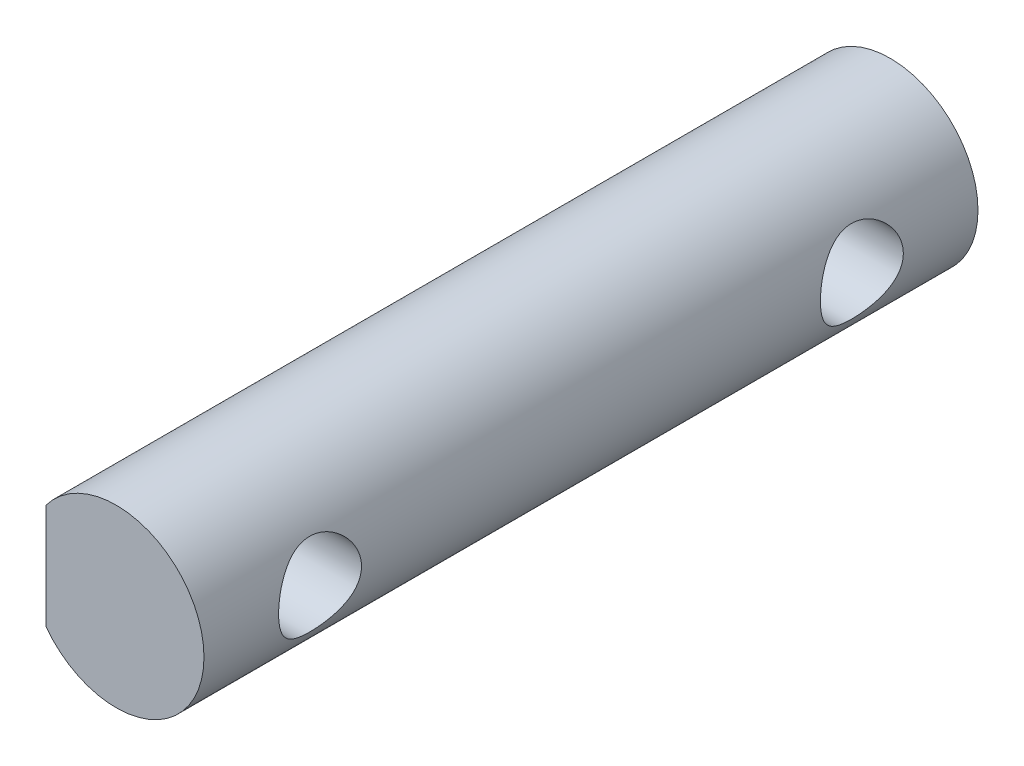
ISO-10303-21;
HEADER;
FILE_DESCRIPTION(('STEP AP214'),'2;1');
FILE_NAME('part.step','',(''),(''),'','','');
FILE_SCHEMA(('AUTOMOTIVE_DESIGN { 1 0 10303 214 1 1 1 1 }'));
ENDSEC;
DATA;
#1=APPLICATION_CONTEXT('core data for automotive mechanical design processes');
#2=APPLICATION_PROTOCOL_DEFINITION('international standard','automotive_design',2000,#1);
#3=PRODUCT_CONTEXT('',#1,'mechanical');
#4=PRODUCT('Part','Part','',(#3));
#5=PRODUCT_RELATED_PRODUCT_CATEGORY('part','',(#4));
#6=PRODUCT_DEFINITION_FORMATION('','',#4);
#7=PRODUCT_DEFINITION_CONTEXT('part definition',#1,'design');
#8=PRODUCT_DEFINITION('design','',#6,#7);
#9=PRODUCT_DEFINITION_SHAPE('','',#8);
#10=(LENGTH_UNIT() NAMED_UNIT(*) SI_UNIT(.MILLI.,.METRE.));
#11=(NAMED_UNIT(*) PLANE_ANGLE_UNIT() SI_UNIT($,.RADIAN.));
#12=(NAMED_UNIT(*) SI_UNIT($,.STERADIAN.) SOLID_ANGLE_UNIT());
#13=UNCERTAINTY_MEASURE_WITH_UNIT(LENGTH_MEASURE(1.E-05),#10,'distance_accuracy_value','');
#14=(GEOMETRIC_REPRESENTATION_CONTEXT(3) GLOBAL_UNCERTAINTY_ASSIGNED_CONTEXT((#13)) GLOBAL_UNIT_ASSIGNED_CONTEXT((#10,
#11,#12)) REPRESENTATION_CONTEXT('',''));
#15=CARTESIAN_POINT('',(0.,0.,0.));
#16=DIRECTION('',(0.,0.,1.));
#17=DIRECTION('',(1.,0.,0.));
#18=AXIS2_PLACEMENT_3D('',#15,#16,#17);
#19=CARTESIAN_POINT('',(0.,0.,28.));
#20=DIRECTION('',(0.,0.,-1.));
#21=DIRECTION('',(-1.,0.,0.));
#22=AXIS2_PLACEMENT_3D('',#19,#20,#21);
#23=CYLINDRICAL_SURFACE('',#22,3.175);
#24=CARTESIAN_POINT('',(3.175,0.,5.7));
#25=CARTESIAN_POINT('',(3.17499621985294,-0.0793696056331877,5.69999552610351));
#26=CARTESIAN_POINT('',(3.17199120370814,-0.158848966213319,5.69366335348418));
#27=CARTESIAN_POINT('',(3.16026762742416,-0.3154907966577,5.6685996128575));
#28=CARTESIAN_POINT('',(3.15153670753249,-0.392647876041672,5.64984122112576));
#29=CARTESIAN_POINT('',(3.1292818514019,-0.54213461401645,5.60080463386028));
#30=CARTESIAN_POINT('',(3.11577583396693,-0.614481134826974,5.57056947468804));
#31=CARTESIAN_POINT('',(3.08523557557938,-0.75298275747988,5.49964446831745));
#32=CARTESIAN_POINT('',(3.06820187122341,-0.819138798737005,5.45895621091421));
#33=CARTESIAN_POINT('',(3.03109215002452,-0.947531977551392,5.36568662754687));
#34=CARTESIAN_POINT('',(3.01089949607389,-1.00934531536298,5.31256891765261));
#35=CARTESIAN_POINT('',(2.97016877751052,-1.12356872804671,5.19709401541805));
#36=CARTESIAN_POINT('',(2.94963048974006,-1.17597245123061,5.13473063351146));
#37=CARTESIAN_POINT('',(2.90895734211161,-1.27340721108708,4.9974843645497));
#38=CARTESIAN_POINT('',(2.88894252906622,-1.31770529611402,4.92204154314482));
#39=CARTESIAN_POINT('',(2.85350194913633,-1.39279860497067,4.76371450605077));
#40=CARTESIAN_POINT('',(2.83807319122874,-1.4236026358555,4.68083518657092));
#41=CARTESIAN_POINT('',(2.81484981523147,-1.46896762087975,4.51481732997647));
#42=CARTESIAN_POINT('',(2.80667245171199,-1.48434942407678,4.43195910458647));
#43=CARTESIAN_POINT('',(2.79782290647243,-1.50096994970779,4.26446669966953));
#44=CARTESIAN_POINT('',(2.79714463118969,-1.5022201551264,4.17983401805993));
#45=CARTESIAN_POINT('',(2.80305593263808,-1.49114871052963,4.02062469140227));
#46=CARTESIAN_POINT('',(2.80889771224103,-1.48022366031689,3.94591684055565));
#47=CARTESIAN_POINT('',(2.82589657910714,-1.44750469243097,3.79955531913525));
#48=CARTESIAN_POINT('',(2.83705508237193,-1.42570787921159,3.72790246774061));
#49=CARTESIAN_POINT('',(2.86368711079333,-1.37144042107045,3.58767854274785));
#50=CARTESIAN_POINT('',(2.87925460442575,-1.33873421633754,3.5192173067294));
#51=CARTESIAN_POINT('',(2.91294481240157,-1.26375034917989,3.38844422930819));
#52=CARTESIAN_POINT('',(2.93106865023239,-1.22146847336964,3.32613511227864));
#53=CARTESIAN_POINT('',(2.97027967308475,-1.12301829304094,3.20211398210142));
#54=CARTESIAN_POINT('',(2.99147184174414,-1.06582685913966,3.14124465826451));
#55=CARTESIAN_POINT('',(3.03276969244737,-0.941911654521739,3.02963307898786));
#56=CARTESIAN_POINT('',(3.05287495516681,-0.875184240523148,2.97889471198725));
#57=CARTESIAN_POINT('',(3.09065813188422,-0.730900451942526,2.8872344695054));
#58=CARTESIAN_POINT('',(3.10821737934191,-0.65303276474939,2.8467498749094));
#59=CARTESIAN_POINT('',(3.13795896561378,-0.490549806409964,2.77976514725872));
#60=CARTESIAN_POINT('',(3.15014513198241,-0.405939389394616,2.75325505672055));
#61=CARTESIAN_POINT('',(3.16698849385516,-0.239325331183663,2.71695327830054));
#62=CARTESIAN_POINT('',(3.17215069636453,-0.157618085372369,2.70603697774866));
#63=CARTESIAN_POINT('',(3.17605374308904,0.00662006237334145,2.69776549827472));
#64=CARTESIAN_POINT('',(3.17479716715133,0.0891506200914326,2.70040487103399));
#65=CARTESIAN_POINT('',(3.16631250425399,0.246790904756254,2.71845895022593));
#66=CARTESIAN_POINT('',(3.15949303898597,0.322025617263288,2.73299968212114));
#67=CARTESIAN_POINT('',(3.14106249856194,0.468859911387633,2.77312746629384));
#68=CARTESIAN_POINT('',(3.12945086824544,0.540459070755478,2.79871579842438));
#69=CARTESIAN_POINT('',(3.10206629000487,0.680482664613306,2.86097277598054));
#70=CARTESIAN_POINT('',(3.0861775760538,0.748744433690326,2.8979545958558));
#71=CARTESIAN_POINT('',(3.05182842645659,0.878333413113474,2.98160542554883));
#72=CARTESIAN_POINT('',(3.0333668635778,0.939657562453442,3.02827868585652));
#73=CARTESIAN_POINT('',(2.99374847615918,1.05944471500475,3.13484016430619));
#74=CARTESIAN_POINT('',(2.97249840501299,1.11715821701519,3.19553803008255));
#75=CARTESIAN_POINT('',(2.9310107026401,1.22187582163969,3.32592004337329));
#76=CARTESIAN_POINT('',(2.91077359415055,1.26887443843489,3.39560876557417));
#77=CARTESIAN_POINT('',(2.87298422238289,1.3523177360002,3.54515860569975));
#78=CARTESIAN_POINT('',(2.85555063245793,1.3883357483136,3.62529027685059));
#79=CARTESIAN_POINT('',(2.82679504093384,1.44599796651068,3.79157573608092));
#80=CARTESIAN_POINT('',(2.81546607860886,1.46765854978947,3.87772253828127));
#81=CARTESIAN_POINT('',(2.80148148307169,1.49416555358527,4.04513659709301));
#82=CARTESIAN_POINT('',(2.79812792823292,1.50036748851185,4.12613047173133));
#83=CARTESIAN_POINT('',(2.79854075870541,1.4995991124721,4.2880256718279));
#84=CARTESIAN_POINT('',(2.80230499174775,1.4926327833113,4.36892701786344));
#85=CARTESIAN_POINT('',(2.81582109373829,1.46695547456854,4.52186185816674));
#86=CARTESIAN_POINT('',(2.82509293077013,1.44918362899975,4.59410031570899));
#87=CARTESIAN_POINT('',(2.84807658169596,1.40347262111118,4.73452895410737));
#88=CARTESIAN_POINT('',(2.86178973121637,1.37553039996268,4.8027179098565));
#89=CARTESIAN_POINT('',(2.89323433363553,1.30816165903836,4.93811055182919));
#90=CARTESIAN_POINT('',(2.9111726221189,1.26809407534009,5.0049459695603));
#91=CARTESIAN_POINT('',(2.94862781691945,1.17838069734069,5.13136079818432));
#92=CARTESIAN_POINT('',(2.96814547541437,1.12873032344155,5.19093671747963));
#93=CARTESIAN_POINT('',(3.00898948839188,1.01518945377103,5.3075560784686));
#94=CARTESIAN_POINT('',(3.03029315236505,0.950355540908534,5.36369381341707));
#95=CARTESIAN_POINT('',(3.07039060771353,0.811506446201234,5.46444175427494));
#96=CARTESIAN_POINT('',(3.08918318329392,0.737486850130158,5.50904638589811));
#97=CARTESIAN_POINT('',(3.12214803509559,0.58231032335967,5.5850463197749));
#98=CARTESIAN_POINT('',(3.13633626105316,0.501179295246576,5.61648733383919));
#99=CARTESIAN_POINT('',(3.15849550789229,0.334041202489533,5.66490242402554));
#100=CARTESIAN_POINT('',(3.16648489362115,0.2480493570789,5.68191924759624));
#101=CARTESIAN_POINT('',(3.17226666174443,0.134449327489636,5.69420643339842));
#102=CARTESIAN_POINT('',(3.17328951708221,0.10761975081623,5.69637655199677));
#103=CARTESIAN_POINT('',(3.17465683516496,0.0538643319459685,5.69927411038089));
#104=CARTESIAN_POINT('',(3.17500128300303,0.0269384876468131,5.70000151846547));
#105=CARTESIAN_POINT('',(3.175,0.,5.7));
#106=B_SPLINE_CURVE_WITH_KNOTS('',3,(#24,#25,#26,#27,#28,#29,#30,#31,#32,#33,#34,#35,#36,#37,
#38,#39,#40,#41,#42,#43,#44,#45,#46,#47,#48,#49,#50,#51,#52,#53,#54,#55,#56,#57,#58,#59,#60,#61,
#62,#63,#64,#65,#66,#67,#68,#69,#70,#71,#72,#73,#74,#75,#76,#77,#78,#79,#80,#81,#82,#83,#84,#85,
#86,#87,#88,#89,#90,#91,#92,#93,#94,#95,#96,#97,#98,#99,#100,#101,#102,#103,#104,#105),
.UNSPECIFIED.,.T.,.F.,(4,2,2,2,2,2,2,2,2,2,2,2,2,2,2,2,2,2,2,2,2,2,2,2,2,2,2,2,2,2,2,2,2,2,2,2,
2,2,2,2,4),(0.,0.237998863435127,0.476513162034361,0.714141760487185,0.951734239756924,
1.202566267352,1.45356698050229,1.72144991719773,1.98915775546694,2.24170968929962,
2.4940563909499,2.72018464462581,2.94637315667184,3.17780125644152,3.40933138528568,
3.66670059385932,3.92416839616743,4.19124985366182,4.45814074508092,4.70459764976704,
4.9509555058397,5.18069145066332,5.41045401730286,5.6472008989094,5.88405183355053,
6.14213867221335,6.40035735120202,6.66760822573517,6.93455372246492,7.17710763594645,
7.41958821796886,7.64352093670395,7.86752106087491,8.10644389425159,8.34548119240929,
8.60934561245708,8.87333732850241,9.13640455025375,9.39868939422998,9.47946576344206,
9.56024390756228),.UNSPECIFIED.);
#107=CARTESIAN_POINT('',(3.175,0.,5.7));
#108=VERTEX_POINT('',#107);
#109=EDGE_CURVE('E77',#108,#108,#106,.T.);
#110=ORIENTED_EDGE('',*,*,#109,.F.);
#111=EDGE_LOOP('',(#110));
#112=FACE_BOUND('',#111,.T.);
#113=CARTESIAN_POINT('',(3.175,0.,25.3));
#114=CARTESIAN_POINT('',(3.17499621985294,-0.079369605633189,25.2999955261035));
#115=CARTESIAN_POINT('',(3.17199120370814,-0.15884896621332,25.2936633534842));
#116=CARTESIAN_POINT('',(3.16026762742416,-0.315490796657701,25.2685996128575));
#117=CARTESIAN_POINT('',(3.15153670753249,-0.392647876041673,25.2498412211258));
#118=CARTESIAN_POINT('',(3.1292818514019,-0.542134614016451,25.2008046338603));
#119=CARTESIAN_POINT('',(3.11577583396693,-0.614481134826975,25.170569474688));
#120=CARTESIAN_POINT('',(3.08523557557938,-0.752982757479882,25.0996444683175));
#121=CARTESIAN_POINT('',(3.06820187122341,-0.819138798737007,25.0589562109142));
#122=CARTESIAN_POINT('',(3.03109215002452,-0.947531977551394,24.9656866275469));
#123=CARTESIAN_POINT('',(3.01089949607389,-1.00934531536298,24.9125689176526));
#124=CARTESIAN_POINT('',(2.97016877751052,-1.12356872804671,24.7970940154181));
#125=CARTESIAN_POINT('',(2.94963048974006,-1.17597245123061,24.7347306335115));
#126=CARTESIAN_POINT('',(2.90895734211161,-1.27340721108708,24.5974843645497));
#127=CARTESIAN_POINT('',(2.88894252906622,-1.31770529611402,24.5220415431448));
#128=CARTESIAN_POINT('',(2.85350194913633,-1.39279860497067,24.3637145060508));
#129=CARTESIAN_POINT('',(2.83807319122874,-1.4236026358555,24.2808351865709));
#130=CARTESIAN_POINT('',(2.81484981523147,-1.46896762087975,24.1148173299765));
#131=CARTESIAN_POINT('',(2.80667245171199,-1.48434942407678,24.0319591045865));
#132=CARTESIAN_POINT('',(2.79782290647243,-1.50096994970779,23.8644666996695));
#133=CARTESIAN_POINT('',(2.79714463118969,-1.5022201551264,23.7798340180599));
#134=CARTESIAN_POINT('',(2.80305593263809,-1.49114871052963,23.6206246914023));
#135=CARTESIAN_POINT('',(2.80889771224103,-1.48022366031688,23.5459168405557));
#136=CARTESIAN_POINT('',(2.82589657910715,-1.44750469243097,23.3995553191353));
#137=CARTESIAN_POINT('',(2.83705508237193,-1.42570787921159,23.3279024677406));
#138=CARTESIAN_POINT('',(2.86368711079333,-1.37144042107045,23.1876785427479));
#139=CARTESIAN_POINT('',(2.87925460442575,-1.33873421633753,23.1192173067294));
#140=CARTESIAN_POINT('',(2.91294481240157,-1.26375034917988,22.9884442293082));
#141=CARTESIAN_POINT('',(2.93106865023239,-1.22146847336964,22.9261351122786));
#142=CARTESIAN_POINT('',(2.97027967308475,-1.12301829304093,22.8021139821014));
#143=CARTESIAN_POINT('',(2.99147184174414,-1.06582685913966,22.7412446582645));
#144=CARTESIAN_POINT('',(3.03276969244737,-0.941911654521736,22.6296330789879));
#145=CARTESIAN_POINT('',(3.05287495516681,-0.875184240523146,22.5788947119873));
#146=CARTESIAN_POINT('',(3.09065813188422,-0.730900451942524,22.4872344695054));
#147=CARTESIAN_POINT('',(3.10821737934191,-0.653032764749388,22.4467498749094));
#148=CARTESIAN_POINT('',(3.13795896561378,-0.490549806409963,22.3797651472587));
#149=CARTESIAN_POINT('',(3.15014513198241,-0.405939389394615,22.3532550567206));
#150=CARTESIAN_POINT('',(3.16698849385516,-0.239325331183662,22.3169532783005));
#151=CARTESIAN_POINT('',(3.17215069636453,-0.157618085372368,22.3060369777487));
#152=CARTESIAN_POINT('',(3.17605374308904,0.00662006237334188,22.2977654982747));
#153=CARTESIAN_POINT('',(3.17479716715133,0.0891506200914329,22.300404871034));
#154=CARTESIAN_POINT('',(3.16631250425399,0.246790904756254,22.3184589502259));
#155=CARTESIAN_POINT('',(3.15949303898597,0.322025617263288,22.3329996821212));
#156=CARTESIAN_POINT('',(3.14106249856194,0.468859911387632,22.3731274662939));
#157=CARTESIAN_POINT('',(3.12945086824544,0.540459070755478,22.3987157984244));
#158=CARTESIAN_POINT('',(3.10206629000487,0.680482664613306,22.4609727759805));
#159=CARTESIAN_POINT('',(3.0861775760538,0.748744433690325,22.4979545958558));
#160=CARTESIAN_POINT('',(3.0518284264566,0.878333413113473,22.5816054255488));
#161=CARTESIAN_POINT('',(3.0333668635778,0.93965756245344,22.6282786858565));
#162=CARTESIAN_POINT('',(2.99374847615918,1.05944471500474,22.7348401643062));
#163=CARTESIAN_POINT('',(2.97249840501299,1.11715821701518,22.7955380300826));
#164=CARTESIAN_POINT('',(2.9310107026401,1.22187582163969,22.9259200433733));
#165=CARTESIAN_POINT('',(2.91077359415055,1.26887443843489,22.9956087655742));
#166=CARTESIAN_POINT('',(2.8729842223829,1.3523177360002,23.1451586056998));
#167=CARTESIAN_POINT('',(2.85555063245793,1.3883357483136,23.2252902768506));
#168=CARTESIAN_POINT('',(2.82679504093384,1.44599796651068,23.3915757360809));
#169=CARTESIAN_POINT('',(2.81546607860886,1.46765854978946,23.4777225382813));
#170=CARTESIAN_POINT('',(2.80148148307169,1.49416555358527,23.645136597093));
#171=CARTESIAN_POINT('',(2.79812792823293,1.50036748851185,23.7261304717313));
#172=CARTESIAN_POINT('',(2.79854075870542,1.4995991124721,23.8880256718279));
#173=CARTESIAN_POINT('',(2.80230499174775,1.49263278331129,23.9689270178635));
#174=CARTESIAN_POINT('',(2.81582109373829,1.46695547456854,24.1218618581667));
#175=CARTESIAN_POINT('',(2.82509293077013,1.44918362899974,24.194100315709));
#176=CARTESIAN_POINT('',(2.84807658169596,1.40347262111117,24.3345289541074));
#177=CARTESIAN_POINT('',(2.86178973121637,1.37553039996267,24.4027179098565));
#178=CARTESIAN_POINT('',(2.89323433363553,1.30816165903835,24.5381105518292));
#179=CARTESIAN_POINT('',(2.9111726221189,1.26809407534009,24.6049459695603));
#180=CARTESIAN_POINT('',(2.94862781691945,1.17838069734069,24.7313607981843));
#181=CARTESIAN_POINT('',(2.96814547541437,1.12873032344155,24.7909367174796));
#182=CARTESIAN_POINT('',(3.00898948839188,1.01518945377102,24.9075560784686));
#183=CARTESIAN_POINT('',(3.03029315236505,0.950355540908527,24.9636938134171));
#184=CARTESIAN_POINT('',(3.07039060771353,0.811506446201227,25.0644417542749));
#185=CARTESIAN_POINT('',(3.08918318329392,0.737486850130152,25.1090463858981));
#186=CARTESIAN_POINT('',(3.12214803509559,0.582310323359664,25.1850463197749));
#187=CARTESIAN_POINT('',(3.13633626105316,0.50117929524657,25.2164873338392));
#188=CARTESIAN_POINT('',(3.15849550789229,0.334041202489527,25.2649024240255));
#189=CARTESIAN_POINT('',(3.16648489362115,0.248049357078894,25.2819192475962));
#190=CARTESIAN_POINT('',(3.17226666174443,0.134449327489631,25.2942064333984));
#191=CARTESIAN_POINT('',(3.17328951708221,0.107619750816226,25.2963765519968));
#192=CARTESIAN_POINT('',(3.17465683516496,0.053864331945966,25.2992741103809));
#193=CARTESIAN_POINT('',(3.17500128300303,0.0269384876468112,25.3000015184655));
#194=CARTESIAN_POINT('',(3.175,0.,25.3));
#195=B_SPLINE_CURVE_WITH_KNOTS('',3,(#113,#114,#115,#116,#117,#118,#119,#120,#121,#122,#123,
#124,#125,#126,#127,#128,#129,#130,#131,#132,#133,#134,#135,#136,#137,#138,#139,#140,#141,#142,
#143,#144,#145,#146,#147,#148,#149,#150,#151,#152,#153,#154,#155,#156,#157,#158,#159,#160,#161,
#162,#163,#164,#165,#166,#167,#168,#169,#170,#171,#172,#173,#174,#175,#176,#177,#178,#179,#180,
#181,#182,#183,#184,#185,#186,#187,#188,#189,#190,#191,#192,#193,#194),.UNSPECIFIED.,.T.,.F.,(4,
2,2,2,2,2,2,2,2,2,2,2,2,2,2,2,2,2,2,2,2,2,2,2,2,2,2,2,2,2,2,2,2,2,2,2,2,2,2,2,4),(0.,
0.237998863435127,0.476513162034361,0.714141760487185,0.951734239756925,1.202566267352,
1.45356698050229,1.72144991719773,1.98915775546694,2.24170968929963,2.4940563909499,
2.72018464462581,2.94637315667183,3.17780125644152,3.40933138528568,3.66670059385932,
3.92416839616743,4.19124985366182,4.45814074508091,4.70459764976703,4.9509555058397,
5.18069145066331,5.41045401730285,5.64720089890939,5.88405183355052,6.14213867221334,
6.40035735120202,6.66760822573517,6.93455372246491,7.17710763594645,7.41958821796885,
7.64352093670394,7.8675210608749,8.10644389425158,8.34548119240928,8.60934561245707,
8.87333732850239,9.13640455025374,9.39868939422997,9.47946576344204,9.56024390756226),.UNSPECIFIED.);
#196=CARTESIAN_POINT('',(3.175,0.,25.3));
#197=VERTEX_POINT('',#196);
#198=EDGE_CURVE('E88',#197,#197,#195,.T.);
#199=ORIENTED_EDGE('',*,*,#198,.F.);
#200=EDGE_LOOP('',(#199));
#201=FACE_BOUND('',#200,.T.);
#202=CARTESIAN_POINT('',(0.,0.,0.));
#203=DIRECTION('',(0.,0.,1.));
#204=DIRECTION('',(1.,0.,0.));
#205=AXIS2_PLACEMENT_3D('',#202,#203,#204);
#206=CIRCLE('',#205,3.175);
#207=CARTESIAN_POINT('',(-2.54,-1.905,0.));
#208=VERTEX_POINT('',#207);
#209=CARTESIAN_POINT('',(-2.54,1.905,0.));
#210=VERTEX_POINT('',#209);
#211=EDGE_CURVE('E71',#208,#210,#206,.T.);
#212=ORIENTED_EDGE('',*,*,#211,.T.);
#213=DIRECTION('',(0.,0.,-1.));
#214=VECTOR('',#213,1.);
#215=CARTESIAN_POINT('',(-2.54,1.905,28.));
#216=LINE('',#215,#214);
#217=CARTESIAN_POINT('',(-2.54,1.905,28.));
#218=VERTEX_POINT('',#217);
#219=EDGE_CURVE('E11',#218,#210,#216,.T.);
#220=ORIENTED_EDGE('',*,*,#219,.F.);
#221=CARTESIAN_POINT('',(0.,0.,28.));
#222=DIRECTION('',(0.,0.,1.));
#223=DIRECTION('',(1.,0.,0.));
#224=AXIS2_PLACEMENT_3D('',#221,#222,#223);
#225=CIRCLE('',#224,3.175);
#226=CARTESIAN_POINT('',(-2.54,-1.905,28.));
#227=VERTEX_POINT('',#226);
#228=EDGE_CURVE('E70',#227,#218,#225,.T.);
#229=ORIENTED_EDGE('',*,*,#228,.F.);
#230=DIRECTION('',(0.,0.,-1.));
#231=VECTOR('',#230,1.);
#232=CARTESIAN_POINT('',(-2.54,-1.905,28.));
#233=LINE('',#232,#231);
#234=EDGE_CURVE('E47',#227,#208,#233,.T.);
#235=ORIENTED_EDGE('',*,*,#234,.T.);
#236=EDGE_LOOP('',(#212,#220,#229,#235));
#237=FACE_BOUND('',#236,.T.);
#238=ADVANCED_FACE('F38',(#112,#201,#237),#23,.T.);
#239=CARTESIAN_POINT('',(-2.54,1.905,28.));
#240=DIRECTION('',(1.,0.,0.));
#241=DIRECTION('',(0.,0.,-1.));
#242=AXIS2_PLACEMENT_3D('',#239,#240,#241);
#243=PLANE('',#242);
#244=CARTESIAN_POINT('',(-2.54,0.,4.2));
#245=DIRECTION('',(-1.,0.,0.));
#246=DIRECTION('',(0.,0.,1.));
#247=AXIS2_PLACEMENT_3D('',#244,#245,#246);
#248=CIRCLE('',#247,1.5);
#249=CARTESIAN_POINT('',(-2.54,0.,5.7));
#250=VERTEX_POINT('',#249);
#251=EDGE_CURVE('E81',#250,#250,#248,.T.);
#252=ORIENTED_EDGE('',*,*,#251,.F.);
#253=EDGE_LOOP('',(#252));
#254=FACE_BOUND('',#253,.T.);
#255=CARTESIAN_POINT('',(-2.54,0.,23.8));
#256=DIRECTION('',(-1.,0.,0.));
#257=DIRECTION('',(0.,0.,1.));
#258=AXIS2_PLACEMENT_3D('',#255,#256,#257);
#259=CIRCLE('',#258,1.5);
#260=CARTESIAN_POINT('',(-2.54,0.,25.3));
#261=VERTEX_POINT('',#260);
#262=EDGE_CURVE('E97',#261,#261,#259,.T.);
#263=ORIENTED_EDGE('',*,*,#262,.F.);
#264=EDGE_LOOP('',(#263));
#265=FACE_BOUND('',#264,.T.);
#266=DIRECTION('',(0.,-1.,0.));
#267=VECTOR('',#266,1.);
#268=CARTESIAN_POINT('',(-2.54,1.905,0.));
#269=LINE('',#268,#267);
#270=EDGE_CURVE('E62',#210,#208,#269,.T.);
#271=ORIENTED_EDGE('',*,*,#270,.T.);
#272=ORIENTED_EDGE('',*,*,#234,.F.);
#273=DIRECTION('',(0.,-1.,0.));
#274=VECTOR('',#273,1.);
#275=CARTESIAN_POINT('',(-2.54,1.905,28.));
#276=LINE('',#275,#274);
#277=EDGE_CURVE('E54',#218,#227,#276,.T.);
#278=ORIENTED_EDGE('',*,*,#277,.F.);
#279=ORIENTED_EDGE('',*,*,#219,.T.);
#280=EDGE_LOOP('',(#271,#272,#278,#279));
#281=FACE_BOUND('',#280,.T.);
#282=ADVANCED_FACE('F65',(#254,#265,#281),#243,.F.);
#283=CARTESIAN_POINT('',(0.,0.,28.));
#284=DIRECTION('',(0.,0.,1.));
#285=DIRECTION('',(1.,0.,0.));
#286=AXIS2_PLACEMENT_3D('',#283,#284,#285);
#287=PLANE('',#286);
#288=ORIENTED_EDGE('',*,*,#228,.T.);
#289=ORIENTED_EDGE('',*,*,#277,.T.);
#290=EDGE_LOOP('',(#288,#289));
#291=FACE_BOUND('',#290,.T.);
#292=ADVANCED_FACE('F103',(#291),#287,.T.);
#293=CARTESIAN_POINT('',(0.,0.,0.));
#294=DIRECTION('',(0.,0.,1.));
#295=DIRECTION('',(1.,0.,0.));
#296=AXIS2_PLACEMENT_3D('',#293,#294,#295);
#297=PLANE('',#296);
#298=ORIENTED_EDGE('',*,*,#211,.F.);
#299=ORIENTED_EDGE('',*,*,#270,.F.);
#300=EDGE_LOOP('',(#298,#299));
#301=FACE_BOUND('',#300,.T.);
#302=ADVANCED_FACE('F75',(#301),#297,.F.);
#303=CARTESIAN_POINT('',(3.176,0.,23.8));
#304=DIRECTION('',(-1.,0.,0.));
#305=DIRECTION('',(0.,0.,1.));
#306=AXIS2_PLACEMENT_3D('',#303,#304,#305);
#307=CYLINDRICAL_SURFACE('',#306,1.5);
#308=ORIENTED_EDGE('',*,*,#198,.T.);
#309=EDGE_LOOP('',(#308));
#310=FACE_BOUND('',#309,.T.);
#311=ORIENTED_EDGE('',*,*,#262,.T.);
#312=EDGE_LOOP('',(#311));
#313=FACE_BOUND('',#312,.T.);
#314=ADVANCED_FACE('F98',(#310,#313),#307,.F.);
#315=CARTESIAN_POINT('',(3.176,0.,4.2));
#316=DIRECTION('',(-1.,0.,0.));
#317=DIRECTION('',(0.,0.,1.));
#318=AXIS2_PLACEMENT_3D('',#315,#316,#317);
#319=CYLINDRICAL_SURFACE('',#318,1.5);
#320=ORIENTED_EDGE('',*,*,#109,.T.);
#321=EDGE_LOOP('',(#320));
#322=FACE_BOUND('',#321,.T.);
#323=ORIENTED_EDGE('',*,*,#251,.T.);
#324=EDGE_LOOP('',(#323));
#325=FACE_BOUND('',#324,.T.);
#326=ADVANCED_FACE('F128',(#322,#325),#319,.F.);
#327=CLOSED_SHELL('',(#238,#282,#292,#302,#314,#326));
#328=MANIFOLD_SOLID_BREP('B2',#327);
#329=ADVANCED_BREP_SHAPE_REPRESENTATION('',(#18,#328),#14);
#330=SHAPE_DEFINITION_REPRESENTATION(#9,#329);
ENDSEC;
END-ISO-10303-21;
